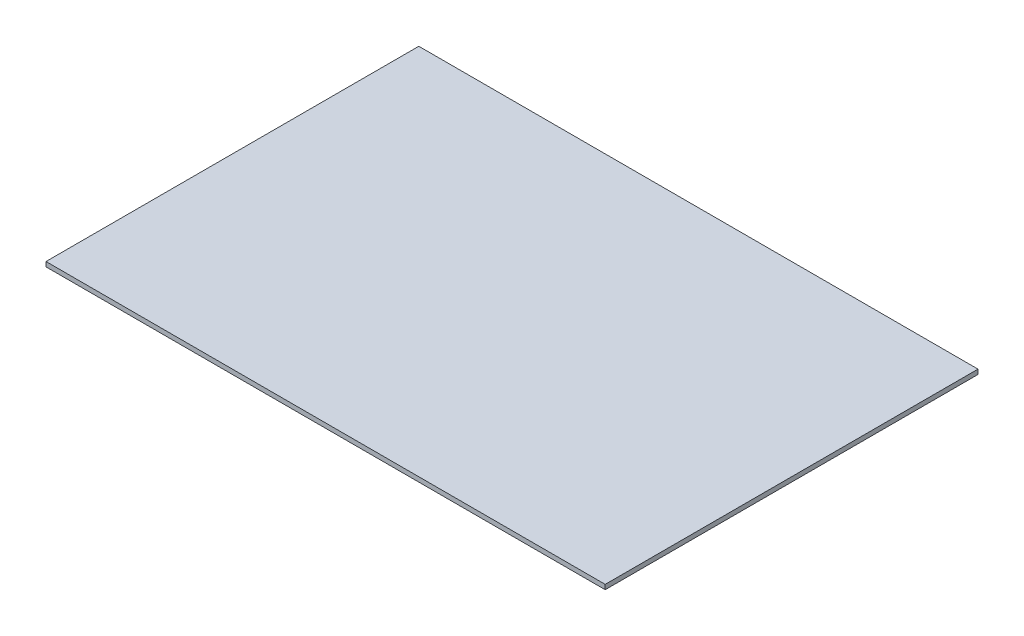
ISO-10303-21;
HEADER;
FILE_DESCRIPTION(('STEP AP214'),'2;1');
FILE_NAME('part.step','',(''),(''),'','','');
FILE_SCHEMA(('AUTOMOTIVE_DESIGN { 1 0 10303 214 1 1 1 1 }'));
ENDSEC;
DATA;
#1=APPLICATION_CONTEXT('core data for automotive mechanical design processes');
#2=APPLICATION_PROTOCOL_DEFINITION('international standard','automotive_design',2000,#1);
#3=PRODUCT_CONTEXT('',#1,'mechanical');
#4=PRODUCT('Part','Part','',(#3));
#5=PRODUCT_RELATED_PRODUCT_CATEGORY('part','',(#4));
#6=PRODUCT_DEFINITION_FORMATION('','',#4);
#7=PRODUCT_DEFINITION_CONTEXT('part definition',#1,'design');
#8=PRODUCT_DEFINITION('design','',#6,#7);
#9=PRODUCT_DEFINITION_SHAPE('','',#8);
#10=(LENGTH_UNIT() NAMED_UNIT(*) SI_UNIT(.MILLI.,.METRE.));
#11=(NAMED_UNIT(*) PLANE_ANGLE_UNIT() SI_UNIT($,.RADIAN.));
#12=(NAMED_UNIT(*) SI_UNIT($,.STERADIAN.) SOLID_ANGLE_UNIT());
#13=UNCERTAINTY_MEASURE_WITH_UNIT(LENGTH_MEASURE(1.E-05),#10,'distance_accuracy_value','');
#14=(GEOMETRIC_REPRESENTATION_CONTEXT(3) GLOBAL_UNCERTAINTY_ASSIGNED_CONTEXT((#13)) GLOBAL_UNIT_ASSIGNED_CONTEXT((#10,
#11,#12)) REPRESENTATION_CONTEXT('',''));
#15=CARTESIAN_POINT('',(0.,0.,0.));
#16=DIRECTION('',(0.,0.,1.));
#17=DIRECTION('',(1.,0.,0.));
#18=AXIS2_PLACEMENT_3D('',#15,#16,#17);
#19=CARTESIAN_POINT('',(0.,2.54,0.));
#20=DIRECTION('',(1.,0.,0.));
#21=DIRECTION('',(0.,0.,-1.));
#22=AXIS2_PLACEMENT_3D('',#19,#20,#21);
#23=PLANE('',#22);
#24=DIRECTION('',(0.,0.,1.));
#25=VECTOR('',#24,1.);
#26=CARTESIAN_POINT('',(0.,0.,0.));
#27=LINE('',#26,#25);
#28=CARTESIAN_POINT('',(0.,0.,-203.2));
#29=VERTEX_POINT('',#28);
#30=CARTESIAN_POINT('',(0.,0.,0.));
#31=VERTEX_POINT('',#30);
#32=EDGE_CURVE('E96',#29,#31,#27,.T.);
#33=ORIENTED_EDGE('',*,*,#32,.T.);
#34=DIRECTION('',(0.,-1.,0.));
#35=VECTOR('',#34,1.);
#36=CARTESIAN_POINT('',(0.,2.54,0.));
#37=LINE('',#36,#35);
#38=CARTESIAN_POINT('',(0.,2.54,0.));
#39=VERTEX_POINT('',#38);
#40=EDGE_CURVE('E11',#39,#31,#37,.T.);
#41=ORIENTED_EDGE('',*,*,#40,.F.);
#42=DIRECTION('',(0.,0.,1.));
#43=VECTOR('',#42,1.);
#44=CARTESIAN_POINT('',(0.,2.54,0.));
#45=LINE('',#44,#43);
#46=CARTESIAN_POINT('',(0.,2.54,-203.2));
#47=VERTEX_POINT('',#46);
#48=EDGE_CURVE('E84',#47,#39,#45,.T.);
#49=ORIENTED_EDGE('',*,*,#48,.F.);
#50=DIRECTION('',(0.,-1.,0.));
#51=VECTOR('',#50,1.);
#52=CARTESIAN_POINT('',(0.,2.54,-203.2));
#53=LINE('',#52,#51);
#54=EDGE_CURVE('E92',#47,#29,#53,.T.);
#55=ORIENTED_EDGE('',*,*,#54,.T.);
#56=EDGE_LOOP('',(#33,#41,#49,#55));
#57=FACE_BOUND('',#56,.T.);
#58=ADVANCED_FACE('F33',(#57),#23,.F.);
#59=CARTESIAN_POINT('',(0.,2.54,0.));
#60=DIRECTION('',(0.,0.,-1.));
#61=DIRECTION('',(-1.,0.,0.));
#62=AXIS2_PLACEMENT_3D('',#59,#60,#61);
#63=PLANE('',#62);
#64=DIRECTION('',(1.,0.,0.));
#65=VECTOR('',#64,1.);
#66=CARTESIAN_POINT('',(0.,0.,0.));
#67=LINE('',#66,#65);
#68=CARTESIAN_POINT('',(304.8,0.,0.));
#69=VERTEX_POINT('',#68);
#70=EDGE_CURVE('E88',#31,#69,#67,.T.);
#71=ORIENTED_EDGE('',*,*,#70,.T.);
#72=DIRECTION('',(0.,-1.,0.));
#73=VECTOR('',#72,1.);
#74=CARTESIAN_POINT('',(304.8,2.54,0.));
#75=LINE('',#74,#73);
#76=CARTESIAN_POINT('',(304.8,2.54,0.));
#77=VERTEX_POINT('',#76);
#78=EDGE_CURVE('E41',#77,#69,#75,.T.);
#79=ORIENTED_EDGE('',*,*,#78,.F.);
#80=DIRECTION('',(1.,0.,0.));
#81=VECTOR('',#80,1.);
#82=CARTESIAN_POINT('',(0.,2.54,0.));
#83=LINE('',#82,#81);
#84=EDGE_CURVE('E79',#39,#77,#83,.T.);
#85=ORIENTED_EDGE('',*,*,#84,.F.);
#86=ORIENTED_EDGE('',*,*,#40,.T.);
#87=EDGE_LOOP('',(#71,#79,#85,#86));
#88=FACE_BOUND('',#87,.T.);
#89=ADVANCED_FACE('F87',(#88),#63,.F.);
#90=CARTESIAN_POINT('',(304.8,2.54,0.));
#91=DIRECTION('',(-1.,0.,0.));
#92=DIRECTION('',(0.,0.,1.));
#93=AXIS2_PLACEMENT_3D('',#90,#91,#92);
#94=PLANE('',#93);
#95=DIRECTION('',(0.,0.,-1.));
#96=VECTOR('',#95,1.);
#97=CARTESIAN_POINT('',(304.8,0.,0.));
#98=LINE('',#97,#96);
#99=CARTESIAN_POINT('',(304.8,0.,-203.2));
#100=VERTEX_POINT('',#99);
#101=EDGE_CURVE('E66',#69,#100,#98,.T.);
#102=ORIENTED_EDGE('',*,*,#101,.T.);
#103=DIRECTION('',(0.,-1.,0.));
#104=VECTOR('',#103,1.);
#105=CARTESIAN_POINT('',(304.8,2.54,-203.2));
#106=LINE('',#105,#104);
#107=CARTESIAN_POINT('',(304.8,2.54,-203.2));
#108=VERTEX_POINT('',#107);
#109=EDGE_CURVE('E89',#108,#100,#106,.T.);
#110=ORIENTED_EDGE('',*,*,#109,.F.);
#111=DIRECTION('',(0.,0.,-1.));
#112=VECTOR('',#111,1.);
#113=CARTESIAN_POINT('',(304.8,2.54,0.));
#114=LINE('',#113,#112);
#115=EDGE_CURVE('E82',#77,#108,#114,.T.);
#116=ORIENTED_EDGE('',*,*,#115,.F.);
#117=ORIENTED_EDGE('',*,*,#78,.T.);
#118=EDGE_LOOP('',(#102,#110,#116,#117));
#119=FACE_BOUND('',#118,.T.);
#120=ADVANCED_FACE('F90',(#119),#94,.F.);
#121=CARTESIAN_POINT('',(0.,2.54,-203.2));
#122=DIRECTION('',(0.,0.,1.));
#123=DIRECTION('',(1.,0.,0.));
#124=AXIS2_PLACEMENT_3D('',#121,#122,#123);
#125=PLANE('',#124);
#126=DIRECTION('',(-1.,0.,0.));
#127=VECTOR('',#126,1.);
#128=CARTESIAN_POINT('',(0.,0.,-203.2));
#129=LINE('',#128,#127);
#130=EDGE_CURVE('E72',#100,#29,#129,.T.);
#131=ORIENTED_EDGE('',*,*,#130,.T.);
#132=ORIENTED_EDGE('',*,*,#54,.F.);
#133=DIRECTION('',(-1.,0.,0.));
#134=VECTOR('',#133,1.);
#135=CARTESIAN_POINT('',(0.,2.54,-203.2));
#136=LINE('',#135,#134);
#137=EDGE_CURVE('E49',#108,#47,#136,.T.);
#138=ORIENTED_EDGE('',*,*,#137,.F.);
#139=ORIENTED_EDGE('',*,*,#109,.T.);
#140=EDGE_LOOP('',(#131,#132,#138,#139));
#141=FACE_BOUND('',#140,.T.);
#142=ADVANCED_FACE('F103',(#141),#125,.F.);
#143=CARTESIAN_POINT('',(0.,2.54,0.));
#144=DIRECTION('',(0.,-1.,0.));
#145=DIRECTION('',(0.,0.,-1.));
#146=AXIS2_PLACEMENT_3D('',#143,#144,#145);
#147=PLANE('',#146);
#148=ORIENTED_EDGE('',*,*,#48,.T.);
#149=ORIENTED_EDGE('',*,*,#84,.T.);
#150=ORIENTED_EDGE('',*,*,#115,.T.);
#151=ORIENTED_EDGE('',*,*,#137,.T.);
#152=EDGE_LOOP('',(#148,#149,#150,#151));
#153=FACE_BOUND('',#152,.T.);
#154=ADVANCED_FACE('F80',(#153),#147,.F.);
#155=CARTESIAN_POINT('',(0.,0.,0.));
#156=DIRECTION('',(0.,-1.,0.));
#157=DIRECTION('',(0.,0.,-1.));
#158=AXIS2_PLACEMENT_3D('',#155,#156,#157);
#159=PLANE('',#158);
#160=ORIENTED_EDGE('',*,*,#32,.F.);
#161=ORIENTED_EDGE('',*,*,#130,.F.);
#162=ORIENTED_EDGE('',*,*,#101,.F.);
#163=ORIENTED_EDGE('',*,*,#70,.F.);
#164=EDGE_LOOP('',(#160,#161,#162,#163));
#165=FACE_BOUND('',#164,.T.);
#166=ADVANCED_FACE('F106',(#165),#159,.T.);
#167=CLOSED_SHELL('',(#58,#89,#120,#142,#154,#166));
#168=MANIFOLD_SOLID_BREP('B2',#167);
#169=ADVANCED_BREP_SHAPE_REPRESENTATION('',(#18,#168),#14);
#170=SHAPE_DEFINITION_REPRESENTATION(#9,#169);
ENDSEC;
END-ISO-10303-21;
